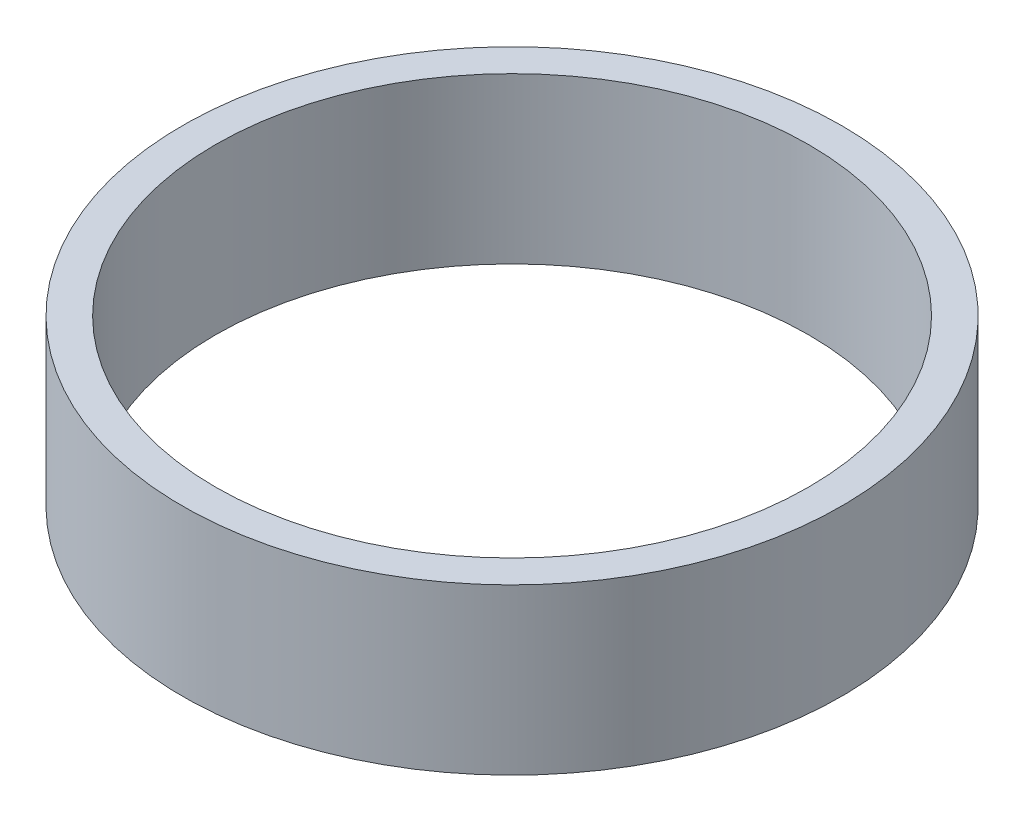
ISO-10303-21;
HEADER;
FILE_DESCRIPTION(('STEP AP214'),'2;1');
FILE_NAME('part.step','',(''),(''),'','','');
FILE_SCHEMA(('AUTOMOTIVE_DESIGN { 1 0 10303 214 1 1 1 1 }'));
ENDSEC;
DATA;
#1=APPLICATION_CONTEXT('core data for automotive mechanical design processes');
#2=APPLICATION_PROTOCOL_DEFINITION('international standard','automotive_design',2000,#1);
#3=PRODUCT_CONTEXT('',#1,'mechanical');
#4=PRODUCT('Part','Part','',(#3));
#5=PRODUCT_RELATED_PRODUCT_CATEGORY('part','',(#4));
#6=PRODUCT_DEFINITION_FORMATION('','',#4);
#7=PRODUCT_DEFINITION_CONTEXT('part definition',#1,'design');
#8=PRODUCT_DEFINITION('design','',#6,#7);
#9=PRODUCT_DEFINITION_SHAPE('','',#8);
#10=(LENGTH_UNIT() NAMED_UNIT(*) SI_UNIT(.MILLI.,.METRE.));
#11=(NAMED_UNIT(*) PLANE_ANGLE_UNIT() SI_UNIT($,.RADIAN.));
#12=(NAMED_UNIT(*) SI_UNIT($,.STERADIAN.) SOLID_ANGLE_UNIT());
#13=UNCERTAINTY_MEASURE_WITH_UNIT(LENGTH_MEASURE(1.E-05),#10,'distance_accuracy_value','');
#14=(GEOMETRIC_REPRESENTATION_CONTEXT(3) GLOBAL_UNCERTAINTY_ASSIGNED_CONTEXT((#13)) GLOBAL_UNIT_ASSIGNED_CONTEXT((#10,
#11,#12)) REPRESENTATION_CONTEXT('',''));
#15=CARTESIAN_POINT('',(0.,0.,0.));
#16=DIRECTION('',(0.,0.,1.));
#17=DIRECTION('',(1.,0.,0.));
#18=AXIS2_PLACEMENT_3D('',#15,#16,#17);
#19=CARTESIAN_POINT('',(0.,19.05,0.));
#20=DIRECTION('',(0.,-1.,0.));
#21=DIRECTION('',(0.,0.,-1.));
#22=AXIS2_PLACEMENT_3D('',#19,#20,#21);
#23=CYLINDRICAL_SURFACE('',#22,68.58);
#24=CARTESIAN_POINT('',(0.,-19.05,0.));
#25=DIRECTION('',(0.,-1.,0.));
#26=DIRECTION('',(0.,0.,-1.));
#27=AXIS2_PLACEMENT_3D('',#24,#25,#26);
#28=CIRCLE('',#27,68.58);
#29=CARTESIAN_POINT('',(0.,-19.05,-68.58));
#30=VERTEX_POINT('',#29);
#31=EDGE_CURVE('E26',#30,#30,#28,.T.);
#32=ORIENTED_EDGE('',*,*,#31,.T.);
#33=EDGE_LOOP('',(#32));
#34=FACE_BOUND('',#33,.T.);
#35=CARTESIAN_POINT('',(0.,19.05,0.));
#36=DIRECTION('',(0.,-1.,0.));
#37=DIRECTION('',(0.,0.,-1.));
#38=AXIS2_PLACEMENT_3D('',#35,#36,#37);
#39=CIRCLE('',#38,68.58);
#40=CARTESIAN_POINT('',(0.,19.05,-68.58));
#41=VERTEX_POINT('',#40);
#42=EDGE_CURVE('E17',#41,#41,#39,.T.);
#43=ORIENTED_EDGE('',*,*,#42,.F.);
#44=EDGE_LOOP('',(#43));
#45=FACE_BOUND('',#44,.T.);
#46=ADVANCED_FACE('F14',(#34,#45),#23,.F.);
#47=CARTESIAN_POINT('',(0.,19.05,0.));
#48=DIRECTION('',(0.,1.,0.));
#49=DIRECTION('',(0.,0.,1.));
#50=AXIS2_PLACEMENT_3D('',#47,#48,#49);
#51=PLANE('',#50);
#52=ORIENTED_EDGE('',*,*,#42,.T.);
#53=EDGE_LOOP('',(#52));
#54=FACE_BOUND('',#53,.T.);
#55=CARTESIAN_POINT('',(0.,19.05,0.));
#56=DIRECTION('',(0.,-1.,0.));
#57=DIRECTION('',(0.,0.,-1.));
#58=AXIS2_PLACEMENT_3D('',#55,#56,#57);
#59=CIRCLE('',#58,76.2);
#60=CARTESIAN_POINT('',(0.,19.05,-76.2));
#61=VERTEX_POINT('',#60);
#62=EDGE_CURVE('E21',#61,#61,#59,.T.);
#63=ORIENTED_EDGE('',*,*,#62,.F.);
#64=EDGE_LOOP('',(#63));
#65=FACE_BOUND('',#64,.T.);
#66=ADVANCED_FACE('F34',(#54,#65),#51,.T.);
#67=CARTESIAN_POINT('',(0.,-19.05,0.));
#68=DIRECTION('',(0.,1.,0.));
#69=DIRECTION('',(0.,0.,1.));
#70=AXIS2_PLACEMENT_3D('',#67,#68,#69);
#71=PLANE('',#70);
#72=ORIENTED_EDGE('',*,*,#31,.F.);
#73=EDGE_LOOP('',(#72));
#74=FACE_BOUND('',#73,.T.);
#75=CARTESIAN_POINT('',(0.,-19.05,0.));
#76=DIRECTION('',(0.,-1.,0.));
#77=DIRECTION('',(0.,0.,-1.));
#78=AXIS2_PLACEMENT_3D('',#75,#76,#77);
#79=CIRCLE('',#78,76.2);
#80=CARTESIAN_POINT('',(0.,-19.05,-76.2));
#81=VERTEX_POINT('',#80);
#82=EDGE_CURVE('E9',#81,#81,#79,.F.);
#83=ORIENTED_EDGE('',*,*,#82,.F.);
#84=EDGE_LOOP('',(#83));
#85=FACE_BOUND('',#84,.T.);
#86=ADVANCED_FACE('F42',(#74,#85),#71,.F.);
#87=CARTESIAN_POINT('',(0.,19.05,0.));
#88=DIRECTION('',(0.,-1.,0.));
#89=DIRECTION('',(0.,0.,-1.));
#90=AXIS2_PLACEMENT_3D('',#87,#88,#89);
#91=CYLINDRICAL_SURFACE('',#90,76.2);
#92=ORIENTED_EDGE('',*,*,#62,.T.);
#93=EDGE_LOOP('',(#92));
#94=FACE_BOUND('',#93,.T.);
#95=ORIENTED_EDGE('',*,*,#82,.T.);
#96=EDGE_LOOP('',(#95));
#97=FACE_BOUND('',#96,.T.);
#98=ADVANCED_FACE('F43',(#94,#97),#91,.T.);
#99=CLOSED_SHELL('',(#46,#66,#86,#98));
#100=MANIFOLD_SOLID_BREP('B1',#99);
#101=ADVANCED_BREP_SHAPE_REPRESENTATION('',(#18,#100),#14);
#102=SHAPE_DEFINITION_REPRESENTATION(#9,#101);
ENDSEC;
END-ISO-10303-21;
